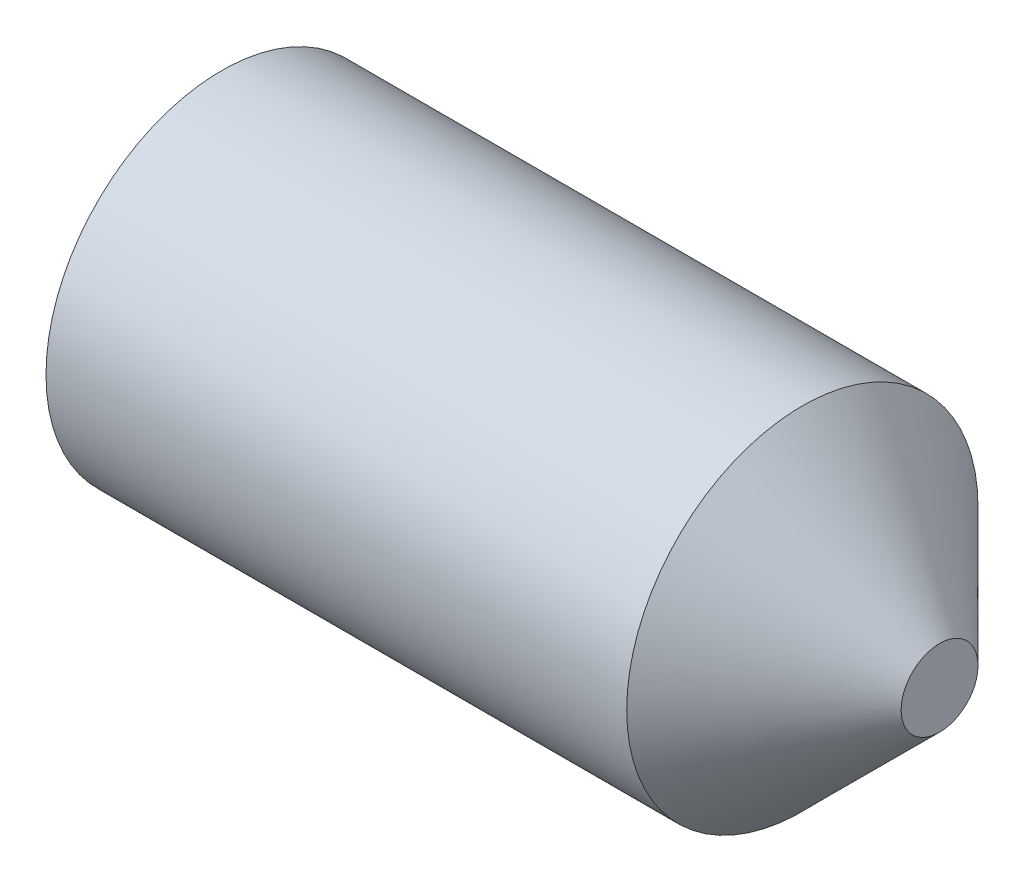
ISO-10303-21;
HEADER;
FILE_DESCRIPTION(('STEP AP214'),'2;1');
FILE_NAME('part.step','',(''),(''),'','','');
FILE_SCHEMA(('AUTOMOTIVE_DESIGN { 1 0 10303 214 1 1 1 1 }'));
ENDSEC;
DATA;
#1=APPLICATION_CONTEXT('core data for automotive mechanical design processes');
#2=APPLICATION_PROTOCOL_DEFINITION('international standard','automotive_design',2000,#1);
#3=PRODUCT_CONTEXT('',#1,'mechanical');
#4=PRODUCT('Part','Part','',(#3));
#5=PRODUCT_RELATED_PRODUCT_CATEGORY('part','',(#4));
#6=PRODUCT_DEFINITION_FORMATION('','',#4);
#7=PRODUCT_DEFINITION_CONTEXT('part definition',#1,'design');
#8=PRODUCT_DEFINITION('design','',#6,#7);
#9=PRODUCT_DEFINITION_SHAPE('','',#8);
#10=(LENGTH_UNIT() NAMED_UNIT(*) SI_UNIT(.MILLI.,.METRE.));
#11=(NAMED_UNIT(*) PLANE_ANGLE_UNIT() SI_UNIT($,.RADIAN.));
#12=(NAMED_UNIT(*) SI_UNIT($,.STERADIAN.) SOLID_ANGLE_UNIT());
#13=UNCERTAINTY_MEASURE_WITH_UNIT(LENGTH_MEASURE(1.E-05),#10,'distance_accuracy_value','');
#14=(GEOMETRIC_REPRESENTATION_CONTEXT(3) GLOBAL_UNCERTAINTY_ASSIGNED_CONTEXT((#13)) GLOBAL_UNIT_ASSIGNED_CONTEXT((#10,
#11,#12)) REPRESENTATION_CONTEXT('',''));
#15=CARTESIAN_POINT('',(0.,0.,0.));
#16=DIRECTION('',(0.,0.,1.));
#17=DIRECTION('',(1.,0.,0.));
#18=AXIS2_PLACEMENT_3D('',#15,#16,#17);
#19=CARTESIAN_POINT('',(0.,0.,0.));
#20=DIRECTION('',(-1.,0.,0.));
#21=DIRECTION('',(0.,0.,1.));
#22=AXIS2_PLACEMENT_3D('',#19,#20,#21);
#23=PLANE('',#22);
#24=CARTESIAN_POINT('',(0.,0.,0.));
#25=DIRECTION('',(-1.,0.,0.));
#26=DIRECTION('',(0.,0.,1.));
#27=AXIS2_PLACEMENT_3D('',#24,#25,#26);
#28=CIRCLE('',#27,10.352);
#29=CARTESIAN_POINT('',(0.,0.,10.352));
#30=VERTEX_POINT('',#29);
#31=EDGE_CURVE('E11',#30,#30,#28,.T.);
#32=ORIENTED_EDGE('',*,*,#31,.T.);
#33=EDGE_LOOP('',(#32));
#34=FACE_BOUND('',#33,.T.);
#35=DIRECTION('',(0.,0.,-1.));
#36=VECTOR('',#35,1.);
#37=CARTESIAN_POINT('',(0.,6.,3.46410161513775));
#38=LINE('',#37,#36);
#39=CARTESIAN_POINT('',(0.,6.,3.46410161513775));
#40=VERTEX_POINT('',#39);
#41=CARTESIAN_POINT('',(0.,6.,-3.46410161513776));
#42=VERTEX_POINT('',#41);
#43=EDGE_CURVE('E126',#40,#42,#38,.T.);
#44=ORIENTED_EDGE('',*,*,#43,.F.);
#45=DIRECTION('',(0.,-0.866025403784439,0.5));
#46=VECTOR('',#45,1.);
#47=CARTESIAN_POINT('',(0.,6.,3.46410161513775));
#48=LINE('',#47,#46);
#49=CARTESIAN_POINT('',(0.,0.,6.9282032302755));
#50=VERTEX_POINT('',#49);
#51=EDGE_CURVE('E48',#40,#50,#48,.T.);
#52=ORIENTED_EDGE('',*,*,#51,.T.);
#53=DIRECTION('',(0.,0.866025403784439,0.5));
#54=VECTOR('',#53,1.);
#55=CARTESIAN_POINT('',(0.,-5.99999999999999,3.46410161513775));
#56=LINE('',#55,#54);
#57=CARTESIAN_POINT('',(0.,-5.99999999999999,3.46410161513775));
#58=VERTEX_POINT('',#57);
#59=EDGE_CURVE('E117',#58,#50,#56,.T.);
#60=ORIENTED_EDGE('',*,*,#59,.F.);
#61=DIRECTION('',(0.,0.,-1.));
#62=VECTOR('',#61,1.);
#63=CARTESIAN_POINT('',(0.,-5.99999999999999,3.46410161513775));
#64=LINE('',#63,#62);
#65=CARTESIAN_POINT('',(0.,-5.99999999999999,-3.46410161513775));
#66=VERTEX_POINT('',#65);
#67=EDGE_CURVE('E120',#58,#66,#64,.T.);
#68=ORIENTED_EDGE('',*,*,#67,.T.);
#69=DIRECTION('',(0.,0.866025403784438,-0.5));
#70=VECTOR('',#69,1.);
#71=CARTESIAN_POINT('',(0.,-5.99999999999999,-3.46410161513775));
#72=LINE('',#71,#70);
#73=CARTESIAN_POINT('',(0.,0.,-6.92820323027551));
#74=VERTEX_POINT('',#73);
#75=EDGE_CURVE('E123',#66,#74,#72,.T.);
#76=ORIENTED_EDGE('',*,*,#75,.T.);
#77=DIRECTION('',(0.,-0.866025403784439,-0.5));
#78=VECTOR('',#77,1.);
#79=CARTESIAN_POINT('',(0.,6.,-3.46410161513776));
#80=LINE('',#79,#78);
#81=EDGE_CURVE('E106',#42,#74,#80,.T.);
#82=ORIENTED_EDGE('',*,*,#81,.F.);
#83=EDGE_LOOP('',(#44,#52,#60,#68,#76,#82));
#84=FACE_BOUND('',#83,.T.);
#85=ADVANCED_FACE('F34',(#34,#84),#23,.T.);
#86=CARTESIAN_POINT('',(0.,0.,0.));
#87=DIRECTION('',(1.,0.,0.));
#88=DIRECTION('',(0.,0.,-1.));
#89=AXIS2_PLACEMENT_3D('',#86,#87,#88);
#90=CONICAL_SURFACE('',#89,10.352,1.0471975511966);
#91=CARTESIAN_POINT('',(0.951473243624499,0.,0.));
#92=DIRECTION('',(-1.,0.,0.));
#93=DIRECTION('',(0.,0.,1.));
#94=AXIS2_PLACEMENT_3D('',#91,#92,#93);
#95=CIRCLE('',#94,12.);
#96=CARTESIAN_POINT('',(0.951473243624499,0.,12.));
#97=VERTEX_POINT('',#96);
#98=EDGE_CURVE('E41',#97,#97,#95,.T.);
#99=ORIENTED_EDGE('',*,*,#98,.T.);
#100=EDGE_LOOP('',(#99));
#101=FACE_BOUND('',#100,.T.);
#102=ORIENTED_EDGE('',*,*,#31,.F.);
#103=EDGE_LOOP('',(#102));
#104=FACE_BOUND('',#103,.T.);
#105=ADVANCED_FACE('F143',(#101,#104),#90,.T.);
#106=CARTESIAN_POINT('',(-12.7,0.,0.));
#107=DIRECTION('',(-1.,0.,0.));
#108=DIRECTION('',(0.,0.,1.));
#109=AXIS2_PLACEMENT_3D('',#106,#107,#108);
#110=CYLINDRICAL_SURFACE('',#109,12.);
#111=CARTESIAN_POINT('',(40.625,0.,0.));
#112=DIRECTION('',(-1.,0.,0.));
#113=DIRECTION('',(0.,0.,1.));
#114=AXIS2_PLACEMENT_3D('',#111,#112,#113);
#115=CIRCLE('',#114,12.);
#116=CARTESIAN_POINT('',(40.625,0.,12.));
#117=VERTEX_POINT('',#116);
#118=EDGE_CURVE('E138',#117,#117,#115,.T.);
#119=ORIENTED_EDGE('',*,*,#118,.T.);
#120=EDGE_LOOP('',(#119));
#121=FACE_BOUND('',#120,.T.);
#122=ORIENTED_EDGE('',*,*,#98,.F.);
#123=EDGE_LOOP('',(#122));
#124=FACE_BOUND('',#123,.T.);
#125=ADVANCED_FACE('F146',(#121,#124),#110,.T.);
#126=CARTESIAN_POINT('',(40.625,0.,0.));
#127=DIRECTION('',(-1.,0.,0.));
#128=DIRECTION('',(0.,0.,1.));
#129=AXIS2_PLACEMENT_3D('',#126,#127,#128);
#130=CONICAL_SURFACE('',#129,12.,0.785398163397447);
#131=CARTESIAN_POINT('',(50.,0.,0.));
#132=DIRECTION('',(-1.,0.,0.));
#133=DIRECTION('',(0.,0.,1.));
#134=AXIS2_PLACEMENT_3D('',#131,#132,#133);
#135=CIRCLE('',#134,2.625);
#136=CARTESIAN_POINT('',(50.,0.,2.625));
#137=VERTEX_POINT('',#136);
#138=EDGE_CURVE('E135',#137,#137,#135,.T.);
#139=CARTESIAN_POINT('',(50.,0.,2.625));
#140=CARTESIAN_POINT('',(49.90234375,0.,2.72265625));
#141=CARTESIAN_POINT('',(49.8046875,0.,2.8203125));
#142=CARTESIAN_POINT('',(49.609375,0.,3.015625));
#143=CARTESIAN_POINT('',(49.51171875,0.,3.11328125));
#144=CARTESIAN_POINT('',(49.31640625,0.,3.30859375));
#145=CARTESIAN_POINT('',(49.21875,0.,3.40625));
#146=CARTESIAN_POINT('',(49.0234375,0.,3.6015625));
#147=CARTESIAN_POINT('',(48.92578125,0.,3.69921875));
#148=CARTESIAN_POINT('',(48.73046875,0.,3.89453125));
#149=CARTESIAN_POINT('',(48.6328125,0.,3.9921875));
#150=CARTESIAN_POINT('',(48.4375,0.,4.1875));
#151=CARTESIAN_POINT('',(48.33984375,0.,4.28515625));
#152=CARTESIAN_POINT('',(48.14453125,0.,4.48046875));
#153=CARTESIAN_POINT('',(48.046875,0.,4.578125));
#154=CARTESIAN_POINT('',(47.8515625,0.,4.7734375));
#155=CARTESIAN_POINT('',(47.75390625,0.,4.87109375));
#156=CARTESIAN_POINT('',(47.55859375,0.,5.06640625));
#157=CARTESIAN_POINT('',(47.4609375,0.,5.1640625));
#158=CARTESIAN_POINT('',(47.265625,0.,5.359375));
#159=CARTESIAN_POINT('',(47.16796875,0.,5.45703125));
#160=CARTESIAN_POINT('',(46.97265625,0.,5.65234375));
#161=CARTESIAN_POINT('',(46.875,0.,5.75));
#162=CARTESIAN_POINT('',(46.6796875,0.,5.9453125));
#163=CARTESIAN_POINT('',(46.58203125,0.,6.04296875));
#164=CARTESIAN_POINT('',(46.38671875,0.,6.23828125));
#165=CARTESIAN_POINT('',(46.2890625,0.,6.3359375));
#166=CARTESIAN_POINT('',(46.09375,0.,6.53125));
#167=CARTESIAN_POINT('',(45.99609375,0.,6.62890625));
#168=CARTESIAN_POINT('',(45.80078125,0.,6.82421875));
#169=CARTESIAN_POINT('',(45.703125,0.,6.921875));
#170=CARTESIAN_POINT('',(45.5078125,0.,7.1171875));
#171=CARTESIAN_POINT('',(45.41015625,0.,7.21484375));
#172=CARTESIAN_POINT('',(45.21484375,0.,7.41015625));
#173=CARTESIAN_POINT('',(45.1171875,0.,7.5078125));
#174=CARTESIAN_POINT('',(44.921875,0.,7.703125));
#175=CARTESIAN_POINT('',(44.82421875,0.,7.80078125));
#176=CARTESIAN_POINT('',(44.62890625,0.,7.99609375));
#177=CARTESIAN_POINT('',(44.53125,0.,8.09375));
#178=CARTESIAN_POINT('',(44.3359375,0.,8.2890625));
#179=CARTESIAN_POINT('',(44.23828125,0.,8.38671875));
#180=CARTESIAN_POINT('',(44.04296875,0.,8.58203125));
#181=CARTESIAN_POINT('',(43.9453125,0.,8.6796875));
#182=CARTESIAN_POINT('',(43.75,0.,8.875));
#183=CARTESIAN_POINT('',(43.65234375,0.,8.97265625));
#184=CARTESIAN_POINT('',(43.45703125,0.,9.16796875));
#185=CARTESIAN_POINT('',(43.359375,0.,9.265625));
#186=CARTESIAN_POINT('',(43.1640625,0.,9.4609375));
#187=CARTESIAN_POINT('',(43.06640625,0.,9.55859375));
#188=CARTESIAN_POINT('',(42.87109375,0.,9.75390625));
#189=CARTESIAN_POINT('',(42.7734375,0.,9.8515625));
#190=CARTESIAN_POINT('',(42.578125,0.,10.046875));
#191=CARTESIAN_POINT('',(42.48046875,0.,10.14453125));
#192=CARTESIAN_POINT('',(42.28515625,0.,10.33984375));
#193=CARTESIAN_POINT('',(42.1875,0.,10.4375));
#194=CARTESIAN_POINT('',(41.9921875,0.,10.6328125));
#195=CARTESIAN_POINT('',(41.89453125,0.,10.73046875));
#196=CARTESIAN_POINT('',(41.69921875,0.,10.92578125));
#197=CARTESIAN_POINT('',(41.6015625,0.,11.0234375));
#198=CARTESIAN_POINT('',(41.40625,0.,11.21875));
#199=CARTESIAN_POINT('',(41.30859375,0.,11.31640625));
#200=CARTESIAN_POINT('',(41.11328125,0.,11.51171875));
#201=CARTESIAN_POINT('',(41.015625,0.,11.609375));
#202=CARTESIAN_POINT('',(40.8203125,0.,11.8046875));
#203=CARTESIAN_POINT('',(40.72265625,0.,11.90234375));
#204=CARTESIAN_POINT('',(40.625,0.,12.));
#205=B_SPLINE_CURVE_WITH_KNOTS('',3,(#139,#140,#141,#142,#143,#144,#145,#146,#147,#148,#149,
#150,#151,#152,#153,#154,#155,#156,#157,#158,#159,#160,#161,#162,#163,#164,#165,#166,#167,#168,
#169,#170,#171,#172,#173,#174,#175,#176,#177,#178,#179,#180,#181,#182,#183,#184,#185,#186,#187,
#188,#189,#190,#191,#192,#193,#194,#195,#196,#197,#198,#199,#200,#201,#202,#203,#204),
.UNSPECIFIED.,.F.,.F.,(4,2,2,2,2,2,2,2,2,2,2,2,2,2,2,2,2,2,2,2,2,2,2,2,2,2,2,2,2,2,2,2,4),(0.,
0.414320379601495,0.828640759202991,1.24296113880448,1.65728151840597,2.07160189800747,
2.48592227760896,2.90024265721045,3.31456303681195,3.72888341641344,4.14320379601494,
4.55752417561643,4.97184455521792,5.38616493481941,5.80048531442091,6.2148056940224,
6.62912607362389,7.04344645322539,7.45776683282688,7.87208721242838,8.28640759202987,
8.70072797163136,9.11504835123285,9.52936873083435,9.94368911043584,10.3580094900373,
10.7723298696388,11.1866502492403,11.6009706288418,12.0152910084433,12.4296113880448,
12.8439317676463,13.2582521472478),.UNSPECIFIED.);
#206=EDGE_CURVE('BSEAM148',#137,#117,#205,.T.);
#207=ORIENTED_EDGE('',*,*,#138,.T.);
#208=ORIENTED_EDGE('',*,*,#118,.F.);
#209=ORIENTED_EDGE('',*,*,#206,.T.);
#210=ORIENTED_EDGE('',*,*,#206,.F.);
#211=EDGE_LOOP('',(#207,#209,#208,#210));
#212=FACE_BOUND('',#211,.T.);
#213=ADVANCED_FACE('F148',(#212),#130,.T.);
#214=CARTESIAN_POINT('',(50.,2.625,0.));
#215=DIRECTION('',(1.,0.,0.));
#216=DIRECTION('',(0.,0.,-1.));
#217=AXIS2_PLACEMENT_3D('',#214,#215,#216);
#218=PLANE('',#217);
#219=ORIENTED_EDGE('',*,*,#138,.F.);
#220=EDGE_LOOP('',(#219));
#221=FACE_BOUND('',#220,.T.);
#222=ADVANCED_FACE('F155',(#221),#218,.T.);
#223=CARTESIAN_POINT('',(15.,6.,3.46410161513775));
#224=DIRECTION('',(0.,-0.5,-0.866025403784439));
#225=DIRECTION('',(0.,0.866025403784439,-0.5));
#226=AXIS2_PLACEMENT_3D('',#223,#224,#225);
#227=PLANE('',#226);
#228=ORIENTED_EDGE('',*,*,#51,.F.);
#229=DIRECTION('',(-1.,0.,0.));
#230=VECTOR('',#229,1.);
#231=CARTESIAN_POINT('',(15.,6.,3.46410161513775));
#232=LINE('',#231,#230);
#233=CARTESIAN_POINT('',(15.,6.,3.46410161513775));
#234=VERTEX_POINT('',#233);
#235=EDGE_CURVE('E53',#234,#40,#232,.T.);
#236=ORIENTED_EDGE('',*,*,#235,.F.);
#237=DIRECTION('',(0.,-0.866025403784439,0.5));
#238=VECTOR('',#237,1.);
#239=CARTESIAN_POINT('',(15.,6.,3.46410161513775));
#240=LINE('',#239,#238);
#241=CARTESIAN_POINT('',(15.,0.,6.9282032302755));
#242=VERTEX_POINT('',#241);
#243=EDGE_CURVE('E80',#234,#242,#240,.T.);
#244=ORIENTED_EDGE('',*,*,#243,.T.);
#245=DIRECTION('',(-1.,0.,0.));
#246=VECTOR('',#245,1.);
#247=CARTESIAN_POINT('',(15.,0.,6.9282032302755));
#248=LINE('',#247,#246);
#249=EDGE_CURVE('E133',#242,#50,#248,.T.);
#250=ORIENTED_EDGE('',*,*,#249,.T.);
#251=EDGE_LOOP('',(#228,#236,#244,#250));
#252=FACE_BOUND('',#251,.T.);
#253=ADVANCED_FACE('F186',(#252),#227,.T.);
#254=CARTESIAN_POINT('',(15.,-5.99999999999999,3.46410161513775));
#255=DIRECTION('',(0.,-0.5,0.866025403784439));
#256=DIRECTION('',(0.,-0.866025403784439,-0.5));
#257=AXIS2_PLACEMENT_3D('',#254,#255,#256);
#258=PLANE('',#257);
#259=ORIENTED_EDGE('',*,*,#59,.T.);
#260=ORIENTED_EDGE('',*,*,#249,.F.);
#261=DIRECTION('',(0.,0.866025403784439,0.5));
#262=VECTOR('',#261,1.);
#263=CARTESIAN_POINT('',(15.,-5.99999999999999,3.46410161513775));
#264=LINE('',#263,#262);
#265=CARTESIAN_POINT('',(15.,-5.99999999999999,3.46410161513775));
#266=VERTEX_POINT('',#265);
#267=EDGE_CURVE('E266',#266,#242,#264,.T.);
#268=ORIENTED_EDGE('',*,*,#267,.F.);
#269=DIRECTION('',(-1.,0.,0.));
#270=VECTOR('',#269,1.);
#271=CARTESIAN_POINT('',(15.,-5.99999999999999,3.46410161513775));
#272=LINE('',#271,#270);
#273=EDGE_CURVE('E131',#266,#58,#272,.T.);
#274=ORIENTED_EDGE('',*,*,#273,.T.);
#275=EDGE_LOOP('',(#259,#260,#268,#274));
#276=FACE_BOUND('',#275,.T.);
#277=ADVANCED_FACE('F182',(#276),#258,.F.);
#278=CARTESIAN_POINT('',(15.,-5.99999999999999,3.46410161513775));
#279=DIRECTION('',(0.,1.,0.));
#280=DIRECTION('',(0.,0.,1.));
#281=AXIS2_PLACEMENT_3D('',#278,#279,#280);
#282=PLANE('',#281);
#283=ORIENTED_EDGE('',*,*,#67,.F.);
#284=ORIENTED_EDGE('',*,*,#273,.F.);
#285=DIRECTION('',(0.,0.,-1.));
#286=VECTOR('',#285,1.);
#287=CARTESIAN_POINT('',(15.,-5.99999999999999,3.46410161513775));
#288=LINE('',#287,#286);
#289=CARTESIAN_POINT('',(15.,-5.99999999999999,-3.46410161513775));
#290=VERTEX_POINT('',#289);
#291=EDGE_CURVE('E101',#266,#290,#288,.T.);
#292=ORIENTED_EDGE('',*,*,#291,.T.);
#293=DIRECTION('',(-1.,0.,0.));
#294=VECTOR('',#293,1.);
#295=CARTESIAN_POINT('',(15.,-5.99999999999999,-3.46410161513775));
#296=LINE('',#295,#294);
#297=EDGE_CURVE('E96',#290,#66,#296,.T.);
#298=ORIENTED_EDGE('',*,*,#297,.T.);
#299=EDGE_LOOP('',(#283,#284,#292,#298));
#300=FACE_BOUND('',#299,.T.);
#301=ADVANCED_FACE('F179',(#300),#282,.T.);
#302=CARTESIAN_POINT('',(15.,-5.99999999999999,-3.46410161513775));
#303=DIRECTION('',(0.,0.5,0.866025403784438));
#304=DIRECTION('',(0.,-0.866025403784438,0.5));
#305=AXIS2_PLACEMENT_3D('',#302,#303,#304);
#306=PLANE('',#305);
#307=ORIENTED_EDGE('',*,*,#75,.F.);
#308=ORIENTED_EDGE('',*,*,#297,.F.);
#309=DIRECTION('',(0.,0.866025403784438,-0.5));
#310=VECTOR('',#309,1.);
#311=CARTESIAN_POINT('',(15.,-5.99999999999999,-3.46410161513775));
#312=LINE('',#311,#310);
#313=CARTESIAN_POINT('',(15.,0.,-6.92820323027551));
#314=VERTEX_POINT('',#313);
#315=EDGE_CURVE('E91',#290,#314,#312,.T.);
#316=ORIENTED_EDGE('',*,*,#315,.T.);
#317=DIRECTION('',(-1.,0.,0.));
#318=VECTOR('',#317,1.);
#319=CARTESIAN_POINT('',(15.,0.,-6.92820323027551));
#320=LINE('',#319,#318);
#321=EDGE_CURVE('E95',#314,#74,#320,.T.);
#322=ORIENTED_EDGE('',*,*,#321,.T.);
#323=EDGE_LOOP('',(#307,#308,#316,#322));
#324=FACE_BOUND('',#323,.T.);
#325=ADVANCED_FACE('F94',(#324),#306,.T.);
#326=CARTESIAN_POINT('',(15.,6.,-3.46410161513776));
#327=DIRECTION('',(0.,0.5,-0.866025403784438));
#328=DIRECTION('',(0.,0.866025403784439,0.5));
#329=AXIS2_PLACEMENT_3D('',#326,#327,#328);
#330=PLANE('',#329);
#331=ORIENTED_EDGE('',*,*,#81,.T.);
#332=ORIENTED_EDGE('',*,*,#321,.F.);
#333=DIRECTION('',(0.,-0.866025403784439,-0.5));
#334=VECTOR('',#333,1.);
#335=CARTESIAN_POINT('',(15.,6.,-3.46410161513776));
#336=LINE('',#335,#334);
#337=CARTESIAN_POINT('',(15.,6.,-3.46410161513776));
#338=VERTEX_POINT('',#337);
#339=EDGE_CURVE('E100',#338,#314,#336,.T.);
#340=ORIENTED_EDGE('',*,*,#339,.F.);
#341=DIRECTION('',(-1.,0.,0.));
#342=VECTOR('',#341,1.);
#343=CARTESIAN_POINT('',(15.,6.,-3.46410161513776));
#344=LINE('',#343,#342);
#345=EDGE_CURVE('E76',#338,#42,#344,.T.);
#346=ORIENTED_EDGE('',*,*,#345,.T.);
#347=EDGE_LOOP('',(#331,#332,#340,#346));
#348=FACE_BOUND('',#347,.T.);
#349=ADVANCED_FACE('F103',(#348),#330,.F.);
#350=CARTESIAN_POINT('',(15.,6.,3.46410161513775));
#351=DIRECTION('',(0.,1.,0.));
#352=DIRECTION('',(0.,0.,1.));
#353=AXIS2_PLACEMENT_3D('',#350,#351,#352);
#354=PLANE('',#353);
#355=ORIENTED_EDGE('',*,*,#43,.T.);
#356=ORIENTED_EDGE('',*,*,#345,.F.);
#357=DIRECTION('',(0.,0.,-1.));
#358=VECTOR('',#357,1.);
#359=CARTESIAN_POINT('',(15.,6.,3.46410161513775));
#360=LINE('',#359,#358);
#361=EDGE_CURVE('E111',#234,#338,#360,.T.);
#362=ORIENTED_EDGE('',*,*,#361,.F.);
#363=ORIENTED_EDGE('',*,*,#235,.T.);
#364=EDGE_LOOP('',(#355,#356,#362,#363));
#365=FACE_BOUND('',#364,.T.);
#366=ADVANCED_FACE('F167',(#365),#354,.F.);
#367=CARTESIAN_POINT('',(15.,12.,0.));
#368=DIRECTION('',(1.,0.,0.));
#369=DIRECTION('',(0.,0.,-1.));
#370=AXIS2_PLACEMENT_3D('',#367,#368,#369);
#371=PLANE('',#370);
#372=ORIENTED_EDGE('',*,*,#243,.F.);
#373=ORIENTED_EDGE('',*,*,#361,.T.);
#374=ORIENTED_EDGE('',*,*,#339,.T.);
#375=ORIENTED_EDGE('',*,*,#315,.F.);
#376=ORIENTED_EDGE('',*,*,#291,.F.);
#377=ORIENTED_EDGE('',*,*,#267,.T.);
#378=EDGE_LOOP('',(#372,#373,#374,#375,#376,#377));
#379=FACE_BOUND('',#378,.T.);
#380=ADVANCED_FACE('F109',(#379),#371,.F.);
#381=CLOSED_SHELL('',(#85,#105,#125,#213,#222,#253,#277,#301,#325,#349,#366,#380));
#382=MANIFOLD_SOLID_BREP('B2',#381);
#383=ADVANCED_BREP_SHAPE_REPRESENTATION('',(#18,#382),#14);
#384=SHAPE_DEFINITION_REPRESENTATION(#9,#383);
ENDSEC;
END-ISO-10303-21;
